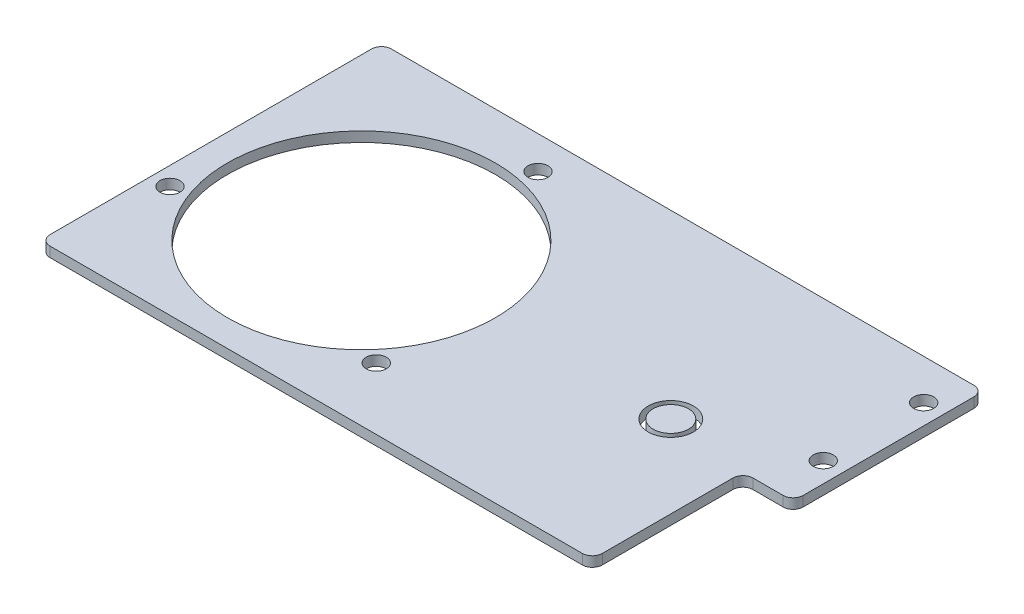
ISO-10303-21;
HEADER;
FILE_DESCRIPTION(('STEP AP214'),'2;1');
FILE_NAME('part.step','',(''),(''),'','','');
FILE_SCHEMA(('AUTOMOTIVE_DESIGN { 1 0 10303 214 1 1 1 1 }'));
ENDSEC;
DATA;
#1=APPLICATION_CONTEXT('core data for automotive mechanical design processes');
#2=APPLICATION_PROTOCOL_DEFINITION('international standard','automotive_design',2000,#1);
#3=PRODUCT_CONTEXT('',#1,'mechanical');
#4=PRODUCT('Part','Part','',(#3));
#5=PRODUCT_RELATED_PRODUCT_CATEGORY('part','',(#4));
#6=PRODUCT_DEFINITION_FORMATION('','',#4);
#7=PRODUCT_DEFINITION_CONTEXT('part definition',#1,'design');
#8=PRODUCT_DEFINITION('design','',#6,#7);
#9=PRODUCT_DEFINITION_SHAPE('','',#8);
#10=(LENGTH_UNIT() NAMED_UNIT(*) SI_UNIT(.MILLI.,.METRE.));
#11=(NAMED_UNIT(*) PLANE_ANGLE_UNIT() SI_UNIT($,.RADIAN.));
#12=(NAMED_UNIT(*) SI_UNIT($,.STERADIAN.) SOLID_ANGLE_UNIT());
#13=UNCERTAINTY_MEASURE_WITH_UNIT(LENGTH_MEASURE(1.E-05),#10,'distance_accuracy_value','');
#14=(GEOMETRIC_REPRESENTATION_CONTEXT(3) GLOBAL_UNCERTAINTY_ASSIGNED_CONTEXT((#13)) GLOBAL_UNIT_ASSIGNED_CONTEXT((#10,
#11,#12)) REPRESENTATION_CONTEXT('',''));
#15=CARTESIAN_POINT('',(0.,0.,0.));
#16=DIRECTION('',(0.,0.,1.));
#17=DIRECTION('',(1.,0.,0.));
#18=AXIS2_PLACEMENT_3D('',#15,#16,#17);
#19=CARTESIAN_POINT('',(254.,6.35,12.7));
#20=DIRECTION('',(0.,-1.,0.));
#21=DIRECTION('',(0.,0.,-1.));
#22=AXIS2_PLACEMENT_3D('',#19,#20,#21);
#23=PLANE('',#22);
#24=CARTESIAN_POINT('',(195.686680000024,6.35,2.27595720048157E-12));
#25=DIRECTION('',(0.,1.,0.));
#26=DIRECTION('',(0.,0.,1.));
#27=AXIS2_PLACEMENT_3D('',#24,#25,#26);
#28=CIRCLE('',#27,14.2875);
#29=CARTESIAN_POINT('',(195.686680000024,6.35,14.2875000000023));
#30=VERTEX_POINT('',#29);
#31=EDGE_CURVE('E12',#30,#30,#28,.T.);
#32=ORIENTED_EDGE('',*,*,#31,.F.);
#33=EDGE_LOOP('',(#32));
#34=FACE_BOUND('',#33,.T.);
#35=CARTESIAN_POINT('',(18.1745568096169,6.35,-93.4999892233898));
#36=DIRECTION('',(0.,1.,0.));
#37=DIRECTION('',(0.,0.,1.));
#38=AXIS2_PLACEMENT_3D('',#35,#36,#37);
#39=CIRCLE('',#38,6.34999999999998);
#40=CARTESIAN_POINT('',(18.1745568096169,6.35,-87.1499892233898));
#41=VERTEX_POINT('',#40);
#42=EDGE_CURVE('E188',#41,#41,#39,.T.);
#43=ORIENTED_EDGE('',*,*,#42,.F.);
#44=EDGE_LOOP('',(#43));
#45=FACE_BOUND('',#44,.T.);
#46=CARTESIAN_POINT('',(266.7,6.35,-88.9000000000001));
#47=DIRECTION('',(0.,1.,0.));
#48=DIRECTION('',(0.,0.,1.));
#49=AXIS2_PLACEMENT_3D('',#46,#47,#48);
#50=CIRCLE('',#49,6.35);
#51=CARTESIAN_POINT('',(266.7,6.35,-82.5500000000001));
#52=VERTEX_POINT('',#51);
#53=EDGE_CURVE('E176',#52,#52,#50,.T.);
#54=ORIENTED_EDGE('',*,*,#53,.F.);
#55=EDGE_LOOP('',(#54));
#56=FACE_BOUND('',#55,.T.);
#57=CARTESIAN_POINT('',(0.,6.35,0.));
#58=DIRECTION('',(0.,1.,0.));
#59=DIRECTION('',(0.,0.,1.));
#60=AXIS2_PLACEMENT_3D('',#57,#58,#59);
#61=CIRCLE('',#60,84.7725);
#62=CARTESIAN_POINT('',(0.,6.35,84.7725));
#63=VERTEX_POINT('',#62);
#64=EDGE_CURVE('E166',#63,#63,#61,.T.);
#65=ORIENTED_EDGE('',*,*,#64,.F.);
#66=EDGE_LOOP('',(#65));
#67=FACE_BOUND('',#66,.T.);
#68=CARTESIAN_POINT('',(254.,6.35,12.7));
#69=DIRECTION('',(0.,-1.,0.));
#70=DIRECTION('',(0.,0.,-1.));
#71=AXIS2_PLACEMENT_3D('',#68,#69,#70);
#72=CIRCLE('',#71,6.35);
#73=CARTESIAN_POINT('',(247.65,6.35,12.7));
#74=VERTEX_POINT('',#73);
#75=CARTESIAN_POINT('',(254.,6.35,6.34999999999998));
#76=VERTEX_POINT('',#75);
#77=EDGE_CURVE('E136',#74,#76,#72,.T.);
#78=ORIENTED_EDGE('',*,*,#77,.T.);
#79=DIRECTION('',(1.,0.,0.));
#80=VECTOR('',#79,1.);
#81=CARTESIAN_POINT('',(254.,6.35,6.34999999999998));
#82=LINE('',#81,#80);
#83=CARTESIAN_POINT('',(273.05,6.35,6.34999999999999));
#84=VERTEX_POINT('',#83);
#85=EDGE_CURVE('E129',#76,#84,#82,.T.);
#86=ORIENTED_EDGE('',*,*,#85,.T.);
#87=CARTESIAN_POINT('',(273.05,6.35,0.));
#88=DIRECTION('',(0.,1.,0.));
#89=DIRECTION('',(0.,0.,1.));
#90=AXIS2_PLACEMENT_3D('',#87,#88,#89);
#91=CIRCLE('',#90,6.35000000000001);
#92=CARTESIAN_POINT('',(279.4,6.35,0.));
#93=VERTEX_POINT('',#92);
#94=EDGE_CURVE('E133',#84,#93,#91,.T.);
#95=ORIENTED_EDGE('',*,*,#94,.T.);
#96=DIRECTION('',(0.,0.,-1.));
#97=VECTOR('',#96,1.);
#98=CARTESIAN_POINT('',(279.4,6.35,-107.95));
#99=LINE('',#98,#97);
#100=CARTESIAN_POINT('',(279.4,6.35,-107.95));
#101=VERTEX_POINT('',#100);
#102=EDGE_CURVE('E154',#93,#101,#99,.T.);
#103=ORIENTED_EDGE('',*,*,#102,.T.);
#104=CARTESIAN_POINT('',(273.05,6.35,-107.95));
#105=DIRECTION('',(0.,1.,0.));
#106=DIRECTION('',(0.,0.,-1.));
#107=AXIS2_PLACEMENT_3D('',#104,#105,#106);
#108=CIRCLE('',#107,6.35000000000002);
#109=CARTESIAN_POINT('',(273.05,6.35,-114.3));
#110=VERTEX_POINT('',#109);
#111=EDGE_CURVE('E156',#101,#110,#108,.T.);
#112=ORIENTED_EDGE('',*,*,#111,.T.);
#113=DIRECTION('',(-1.,0.,0.));
#114=VECTOR('',#113,1.);
#115=CARTESIAN_POINT('',(273.05,6.35,-114.3));
#116=LINE('',#115,#114);
#117=CARTESIAN_POINT('',(-95.25,6.35,-114.3));
#118=VERTEX_POINT('',#117);
#119=EDGE_CURVE('E263',#110,#118,#116,.T.);
#120=ORIENTED_EDGE('',*,*,#119,.T.);
#121=CARTESIAN_POINT('',(-95.25,6.35,-107.95));
#122=DIRECTION('',(0.,1.,0.));
#123=DIRECTION('',(0.,0.,1.));
#124=AXIS2_PLACEMENT_3D('',#121,#122,#123);
#125=CIRCLE('',#124,6.35);
#126=CARTESIAN_POINT('',(-101.6,6.35,-107.95));
#127=VERTEX_POINT('',#126);
#128=EDGE_CURVE('E261',#118,#127,#125,.T.);
#129=ORIENTED_EDGE('',*,*,#128,.T.);
#130=DIRECTION('',(0.,0.,1.));
#131=VECTOR('',#130,1.);
#132=CARTESIAN_POINT('',(-101.6,6.35,-107.95));
#133=LINE('',#132,#131);
#134=CARTESIAN_POINT('',(-101.6,6.35,95.25));
#135=VERTEX_POINT('',#134);
#136=EDGE_CURVE('E259',#127,#135,#133,.T.);
#137=ORIENTED_EDGE('',*,*,#136,.T.);
#138=CARTESIAN_POINT('',(-95.2499999999999,6.35,95.2500000000001));
#139=DIRECTION('',(0.,1.,0.));
#140=DIRECTION('',(0.,0.,-1.));
#141=AXIS2_PLACEMENT_3D('',#138,#139,#140);
#142=CIRCLE('',#141,6.34999999999999);
#143=CARTESIAN_POINT('',(-95.2499999999999,6.35,101.6));
#144=VERTEX_POINT('',#143);
#145=EDGE_CURVE('E257',#135,#144,#142,.T.);
#146=ORIENTED_EDGE('',*,*,#145,.T.);
#147=DIRECTION('',(1.,0.,0.));
#148=VECTOR('',#147,1.);
#149=CARTESIAN_POINT('',(241.3,6.35,101.6));
#150=LINE('',#149,#148);
#151=CARTESIAN_POINT('',(241.3,6.35,101.6));
#152=VERTEX_POINT('',#151);
#153=EDGE_CURVE('E255',#144,#152,#150,.T.);
#154=ORIENTED_EDGE('',*,*,#153,.T.);
#155=CARTESIAN_POINT('',(241.3,6.35,95.25));
#156=DIRECTION('',(0.,1.,0.));
#157=DIRECTION('',(0.,0.,1.));
#158=AXIS2_PLACEMENT_3D('',#155,#156,#157);
#159=CIRCLE('',#158,6.34999999999999);
#160=CARTESIAN_POINT('',(247.65,6.35,95.25));
#161=VERTEX_POINT('',#160);
#162=EDGE_CURVE('E253',#152,#161,#159,.T.);
#163=ORIENTED_EDGE('',*,*,#162,.T.);
#164=DIRECTION('',(0.,0.,-1.));
#165=VECTOR('',#164,1.);
#166=CARTESIAN_POINT('',(247.65,6.35,95.25));
#167=LINE('',#166,#165);
#168=EDGE_CURVE('E191',#161,#74,#167,.T.);
#169=ORIENTED_EDGE('',*,*,#168,.T.);
#170=EDGE_LOOP('',(#78,#86,#95,#103,#112,#120,#129,#137,#146,#154,#163,#169));
#171=FACE_BOUND('',#170,.T.);
#172=CARTESIAN_POINT('',(-90.0606443258351,6.35,31.0103667120436));
#173=DIRECTION('',(0.,1.,0.));
#174=DIRECTION('',(0.,0.,1.));
#175=AXIS2_PLACEMENT_3D('',#172,#173,#174);
#176=CIRCLE('',#175,6.35);
#177=CARTESIAN_POINT('',(-90.0606443258351,6.35,37.3603667120436));
#178=VERTEX_POINT('',#177);
#179=EDGE_CURVE('E169',#178,#178,#176,.T.);
#180=ORIENTED_EDGE('',*,*,#179,.F.);
#181=EDGE_LOOP('',(#180));
#182=FACE_BOUND('',#181,.T.);
#183=CARTESIAN_POINT('',(266.7,6.35,-25.4000000000001));
#184=DIRECTION('',(0.,1.,0.));
#185=DIRECTION('',(0.,0.,1.));
#186=AXIS2_PLACEMENT_3D('',#183,#184,#185);
#187=CIRCLE('',#186,6.35);
#188=CARTESIAN_POINT('',(266.7,6.35,-19.0500000000001));
#189=VERTEX_POINT('',#188);
#190=EDGE_CURVE('E182',#189,#189,#187,.T.);
#191=ORIENTED_EDGE('',*,*,#190,.F.);
#192=EDGE_LOOP('',(#191));
#193=FACE_BOUND('',#192,.T.);
#194=CARTESIAN_POINT('',(71.8860875162181,6.35,62.4896225113469));
#195=DIRECTION('',(0.,1.,0.));
#196=DIRECTION('',(0.,0.,1.));
#197=AXIS2_PLACEMENT_3D('',#194,#195,#196);
#198=CIRCLE('',#197,6.35);
#199=CARTESIAN_POINT('',(71.8860875162181,6.35,68.8396225113469));
#200=VERTEX_POINT('',#199);
#201=EDGE_CURVE('E194',#200,#200,#198,.T.);
#202=ORIENTED_EDGE('',*,*,#201,.F.);
#203=EDGE_LOOP('',(#202));
#204=FACE_BOUND('',#203,.T.);
#205=ADVANCED_FACE('F44',(#34,#45,#56,#67,#171,#182,#193,#204),#23,.F.);
#206=CARTESIAN_POINT('',(254.,0.,12.7));
#207=DIRECTION('',(0.,-1.,0.));
#208=DIRECTION('',(0.,0.,-1.));
#209=AXIS2_PLACEMENT_3D('',#206,#207,#208);
#210=PLANE('',#209);
#211=CARTESIAN_POINT('',(195.686680000024,0.,2.27595720048157E-12));
#212=DIRECTION('',(0.,-1.,0.));
#213=DIRECTION('',(0.,0.,-1.));
#214=AXIS2_PLACEMENT_3D('',#211,#212,#213);
#215=CIRCLE('',#214,14.2875);
#216=CARTESIAN_POINT('',(195.686680000024,0.,-14.2874999999977));
#217=VERTEX_POINT('',#216);
#218=EDGE_CURVE('E52',#217,#217,#215,.T.);
#219=ORIENTED_EDGE('',*,*,#218,.F.);
#220=EDGE_LOOP('',(#219));
#221=FACE_BOUND('',#220,.T.);
#222=CARTESIAN_POINT('',(18.1745568096169,0.,-93.4999892233898));
#223=DIRECTION('',(0.,1.,0.));
#224=DIRECTION('',(0.,0.,1.));
#225=AXIS2_PLACEMENT_3D('',#222,#223,#224);
#226=CIRCLE('',#225,6.34999999999998);
#227=CARTESIAN_POINT('',(18.1745568096169,0.,-87.1499892233898));
#228=VERTEX_POINT('',#227);
#229=EDGE_CURVE('E179',#228,#228,#226,.T.);
#230=ORIENTED_EDGE('',*,*,#229,.T.);
#231=EDGE_LOOP('',(#230));
#232=FACE_BOUND('',#231,.T.);
#233=CARTESIAN_POINT('',(266.7,0.,-88.9000000000001));
#234=DIRECTION('',(0.,1.,0.));
#235=DIRECTION('',(0.,0.,1.));
#236=AXIS2_PLACEMENT_3D('',#233,#234,#235);
#237=CIRCLE('',#236,6.35);
#238=CARTESIAN_POINT('',(266.7,0.,-82.5500000000001));
#239=VERTEX_POINT('',#238);
#240=EDGE_CURVE('E165',#239,#239,#237,.T.);
#241=ORIENTED_EDGE('',*,*,#240,.T.);
#242=EDGE_LOOP('',(#241));
#243=FACE_BOUND('',#242,.T.);
#244=CARTESIAN_POINT('',(0.,0.,0.));
#245=DIRECTION('',(0.,1.,0.));
#246=DIRECTION('',(0.,0.,1.));
#247=AXIS2_PLACEMENT_3D('',#244,#245,#246);
#248=CIRCLE('',#247,84.7725);
#249=CARTESIAN_POINT('',(0.,0.,84.7725));
#250=VERTEX_POINT('',#249);
#251=EDGE_CURVE('E161',#250,#250,#248,.T.);
#252=ORIENTED_EDGE('',*,*,#251,.T.);
#253=EDGE_LOOP('',(#252));
#254=FACE_BOUND('',#253,.T.);
#255=CARTESIAN_POINT('',(254.,0.,12.7));
#256=DIRECTION('',(0.,-1.,0.));
#257=DIRECTION('',(0.,0.,-1.));
#258=AXIS2_PLACEMENT_3D('',#255,#256,#257);
#259=CIRCLE('',#258,6.35);
#260=CARTESIAN_POINT('',(247.65,0.,12.7));
#261=VERTEX_POINT('',#260);
#262=CARTESIAN_POINT('',(254.,0.,6.34999999999998));
#263=VERTEX_POINT('',#262);
#264=EDGE_CURVE('E196',#261,#263,#259,.T.);
#265=ORIENTED_EDGE('',*,*,#264,.F.);
#266=DIRECTION('',(0.,0.,-1.));
#267=VECTOR('',#266,1.);
#268=CARTESIAN_POINT('',(247.65,0.,95.25));
#269=LINE('',#268,#267);
#270=CARTESIAN_POINT('',(247.65,0.,95.25));
#271=VERTEX_POINT('',#270);
#272=EDGE_CURVE('E60',#271,#261,#269,.T.);
#273=ORIENTED_EDGE('',*,*,#272,.F.);
#274=CARTESIAN_POINT('',(241.3,0.,95.25));
#275=DIRECTION('',(0.,1.,0.));
#276=DIRECTION('',(0.,0.,1.));
#277=AXIS2_PLACEMENT_3D('',#274,#275,#276);
#278=CIRCLE('',#277,6.34999999999999);
#279=CARTESIAN_POINT('',(241.3,0.,101.6));
#280=VERTEX_POINT('',#279);
#281=EDGE_CURVE('E232',#280,#271,#278,.T.);
#282=ORIENTED_EDGE('',*,*,#281,.F.);
#283=DIRECTION('',(1.,0.,0.));
#284=VECTOR('',#283,1.);
#285=CARTESIAN_POINT('',(241.3,0.,101.6));
#286=LINE('',#285,#284);
#287=CARTESIAN_POINT('',(-95.2499999999999,0.,101.6));
#288=VERTEX_POINT('',#287);
#289=EDGE_CURVE('E228',#288,#280,#286,.T.);
#290=ORIENTED_EDGE('',*,*,#289,.F.);
#291=CARTESIAN_POINT('',(-95.2499999999999,0.,95.2500000000001));
#292=DIRECTION('',(0.,1.,0.));
#293=DIRECTION('',(0.,0.,-1.));
#294=AXIS2_PLACEMENT_3D('',#291,#292,#293);
#295=CIRCLE('',#294,6.34999999999999);
#296=CARTESIAN_POINT('',(-101.6,0.,95.25));
#297=VERTEX_POINT('',#296);
#298=EDGE_CURVE('E224',#297,#288,#295,.T.);
#299=ORIENTED_EDGE('',*,*,#298,.F.);
#300=DIRECTION('',(0.,0.,1.));
#301=VECTOR('',#300,1.);
#302=CARTESIAN_POINT('',(-101.6,0.,-107.95));
#303=LINE('',#302,#301);
#304=CARTESIAN_POINT('',(-101.6,0.,-107.95));
#305=VERTEX_POINT('',#304);
#306=EDGE_CURVE('E220',#305,#297,#303,.T.);
#307=ORIENTED_EDGE('',*,*,#306,.F.);
#308=CARTESIAN_POINT('',(-95.25,0.,-107.95));
#309=DIRECTION('',(0.,1.,0.));
#310=DIRECTION('',(0.,0.,1.));
#311=AXIS2_PLACEMENT_3D('',#308,#309,#310);
#312=CIRCLE('',#311,6.35);
#313=CARTESIAN_POINT('',(-95.25,0.,-114.3));
#314=VERTEX_POINT('',#313);
#315=EDGE_CURVE('E216',#314,#305,#312,.T.);
#316=ORIENTED_EDGE('',*,*,#315,.F.);
#317=DIRECTION('',(-1.,0.,0.));
#318=VECTOR('',#317,1.);
#319=CARTESIAN_POINT('',(273.05,0.,-114.3));
#320=LINE('',#319,#318);
#321=CARTESIAN_POINT('',(273.05,0.,-114.3));
#322=VERTEX_POINT('',#321);
#323=EDGE_CURVE('E212',#322,#314,#320,.T.);
#324=ORIENTED_EDGE('',*,*,#323,.F.);
#325=CARTESIAN_POINT('',(273.05,0.,-107.95));
#326=DIRECTION('',(0.,1.,0.));
#327=DIRECTION('',(0.,0.,-1.));
#328=AXIS2_PLACEMENT_3D('',#325,#326,#327);
#329=CIRCLE('',#328,6.35000000000002);
#330=CARTESIAN_POINT('',(279.4,0.,-107.95));
#331=VERTEX_POINT('',#330);
#332=EDGE_CURVE('E208',#331,#322,#329,.T.);
#333=ORIENTED_EDGE('',*,*,#332,.F.);
#334=DIRECTION('',(0.,0.,-1.));
#335=VECTOR('',#334,1.);
#336=CARTESIAN_POINT('',(279.4,0.,-107.95));
#337=LINE('',#336,#335);
#338=CARTESIAN_POINT('',(279.4,0.,0.));
#339=VERTEX_POINT('',#338);
#340=EDGE_CURVE('E147',#339,#331,#337,.T.);
#341=ORIENTED_EDGE('',*,*,#340,.F.);
#342=CARTESIAN_POINT('',(273.05,0.,0.));
#343=DIRECTION('',(0.,1.,0.));
#344=DIRECTION('',(0.,0.,1.));
#345=AXIS2_PLACEMENT_3D('',#342,#343,#344);
#346=CIRCLE('',#345,6.35000000000001);
#347=CARTESIAN_POINT('',(273.05,0.,6.34999999999999));
#348=VERTEX_POINT('',#347);
#349=EDGE_CURVE('E148',#348,#339,#346,.T.);
#350=ORIENTED_EDGE('',*,*,#349,.F.);
#351=DIRECTION('',(1.,0.,0.));
#352=VECTOR('',#351,1.);
#353=CARTESIAN_POINT('',(254.,0.,6.34999999999998));
#354=LINE('',#353,#352);
#355=EDGE_CURVE('E144',#263,#348,#354,.T.);
#356=ORIENTED_EDGE('',*,*,#355,.F.);
#357=EDGE_LOOP('',(#265,#273,#282,#290,#299,#307,#316,#324,#333,#341,#350,#356));
#358=FACE_BOUND('',#357,.T.);
#359=CARTESIAN_POINT('',(-90.0606443258351,0.,31.0103667120436));
#360=DIRECTION('',(0.,1.,0.));
#361=DIRECTION('',(0.,0.,1.));
#362=AXIS2_PLACEMENT_3D('',#359,#360,#361);
#363=CIRCLE('',#362,6.35);
#364=CARTESIAN_POINT('',(-90.0606443258351,0.,37.3603667120436));
#365=VERTEX_POINT('',#364);
#366=EDGE_CURVE('E164',#365,#365,#363,.T.);
#367=ORIENTED_EDGE('',*,*,#366,.T.);
#368=EDGE_LOOP('',(#367));
#369=FACE_BOUND('',#368,.T.);
#370=CARTESIAN_POINT('',(266.7,0.,-25.4000000000001));
#371=DIRECTION('',(0.,1.,0.));
#372=DIRECTION('',(0.,0.,1.));
#373=AXIS2_PLACEMENT_3D('',#370,#371,#372);
#374=CIRCLE('',#373,6.35);
#375=CARTESIAN_POINT('',(266.7,0.,-19.0500000000001));
#376=VERTEX_POINT('',#375);
#377=EDGE_CURVE('E173',#376,#376,#374,.T.);
#378=ORIENTED_EDGE('',*,*,#377,.T.);
#379=EDGE_LOOP('',(#378));
#380=FACE_BOUND('',#379,.T.);
#381=CARTESIAN_POINT('',(71.8860875162181,0.,62.4896225113469));
#382=DIRECTION('',(0.,1.,0.));
#383=DIRECTION('',(0.,0.,1.));
#384=AXIS2_PLACEMENT_3D('',#381,#382,#383);
#385=CIRCLE('',#384,6.35);
#386=CARTESIAN_POINT('',(71.8860875162181,0.,68.8396225113469));
#387=VERTEX_POINT('',#386);
#388=EDGE_CURVE('E185',#387,#387,#385,.T.);
#389=ORIENTED_EDGE('',*,*,#388,.T.);
#390=EDGE_LOOP('',(#389));
#391=FACE_BOUND('',#390,.T.);
#392=ADVANCED_FACE('F306',(#221,#232,#243,#254,#358,#369,#380,#391),#210,.T.);
#393=CARTESIAN_POINT('',(254.,6.35,12.7));
#394=DIRECTION('',(0.,-1.,0.));
#395=DIRECTION('',(0.,0.,-1.));
#396=AXIS2_PLACEMENT_3D('',#393,#394,#395);
#397=CYLINDRICAL_SURFACE('',#396,6.35);
#398=ORIENTED_EDGE('',*,*,#264,.T.);
#399=DIRECTION('',(0.,-1.,0.));
#400=VECTOR('',#399,1.);
#401=CARTESIAN_POINT('',(254.,6.35,6.34999999999998));
#402=LINE('',#401,#400);
#403=EDGE_CURVE('E205',#76,#263,#402,.T.);
#404=ORIENTED_EDGE('',*,*,#403,.F.);
#405=ORIENTED_EDGE('',*,*,#77,.F.);
#406=DIRECTION('',(0.,-1.,0.));
#407=VECTOR('',#406,1.);
#408=CARTESIAN_POINT('',(247.65,6.35,12.7));
#409=LINE('',#408,#407);
#410=EDGE_CURVE('E237',#74,#261,#409,.T.);
#411=ORIENTED_EDGE('',*,*,#410,.T.);
#412=EDGE_LOOP('',(#398,#404,#405,#411));
#413=FACE_BOUND('',#412,.T.);
#414=ADVANCED_FACE('F304',(#413),#397,.F.);
#415=CARTESIAN_POINT('',(254.,6.35,6.34999999999998));
#416=DIRECTION('',(0.,0.,-1.));
#417=DIRECTION('',(-1.,0.,0.));
#418=AXIS2_PLACEMENT_3D('',#415,#416,#417);
#419=PLANE('',#418);
#420=ORIENTED_EDGE('',*,*,#355,.T.);
#421=DIRECTION('',(0.,-1.,0.));
#422=VECTOR('',#421,1.);
#423=CARTESIAN_POINT('',(273.05,6.35,6.34999999999999));
#424=LINE('',#423,#422);
#425=EDGE_CURVE('E142',#84,#348,#424,.T.);
#426=ORIENTED_EDGE('',*,*,#425,.F.);
#427=ORIENTED_EDGE('',*,*,#85,.F.);
#428=ORIENTED_EDGE('',*,*,#403,.T.);
#429=EDGE_LOOP('',(#420,#426,#427,#428));
#430=FACE_BOUND('',#429,.T.);
#431=ADVANCED_FACE('F143',(#430),#419,.F.);
#432=CARTESIAN_POINT('',(273.05,6.35,0.));
#433=DIRECTION('',(0.,-1.,0.));
#434=DIRECTION('',(0.,0.,-1.));
#435=AXIS2_PLACEMENT_3D('',#432,#433,#434);
#436=CYLINDRICAL_SURFACE('',#435,6.35000000000001);
#437=ORIENTED_EDGE('',*,*,#349,.T.);
#438=DIRECTION('',(0.,-1.,0.));
#439=VECTOR('',#438,1.);
#440=CARTESIAN_POINT('',(279.4,6.35,0.));
#441=LINE('',#440,#439);
#442=EDGE_CURVE('E152',#93,#339,#441,.T.);
#443=ORIENTED_EDGE('',*,*,#442,.F.);
#444=ORIENTED_EDGE('',*,*,#94,.F.);
#445=ORIENTED_EDGE('',*,*,#425,.T.);
#446=EDGE_LOOP('',(#437,#443,#444,#445));
#447=FACE_BOUND('',#446,.T.);
#448=ADVANCED_FACE('F150',(#447),#436,.T.);
#449=CARTESIAN_POINT('',(279.4,6.35,-107.95));
#450=DIRECTION('',(-1.,0.,0.));
#451=DIRECTION('',(0.,0.,1.));
#452=AXIS2_PLACEMENT_3D('',#449,#450,#451);
#453=PLANE('',#452);
#454=ORIENTED_EDGE('',*,*,#340,.T.);
#455=DIRECTION('',(0.,-1.,0.));
#456=VECTOR('',#455,1.);
#457=CARTESIAN_POINT('',(279.4,6.35,-107.95));
#458=LINE('',#457,#456);
#459=EDGE_CURVE('E209',#101,#331,#458,.T.);
#460=ORIENTED_EDGE('',*,*,#459,.F.);
#461=ORIENTED_EDGE('',*,*,#102,.F.);
#462=ORIENTED_EDGE('',*,*,#442,.T.);
#463=EDGE_LOOP('',(#454,#460,#461,#462));
#464=FACE_BOUND('',#463,.T.);
#465=ADVANCED_FACE('F310',(#464),#453,.F.);
#466=CARTESIAN_POINT('',(273.05,6.35,-107.95));
#467=DIRECTION('',(0.,-1.,0.));
#468=DIRECTION('',(0.,0.,-1.));
#469=AXIS2_PLACEMENT_3D('',#466,#467,#468);
#470=CYLINDRICAL_SURFACE('',#469,6.35000000000002);
#471=ORIENTED_EDGE('',*,*,#332,.T.);
#472=DIRECTION('',(0.,-1.,0.));
#473=VECTOR('',#472,1.);
#474=CARTESIAN_POINT('',(273.05,6.35,-114.3));
#475=LINE('',#474,#473);
#476=EDGE_CURVE('E213',#110,#322,#475,.T.);
#477=ORIENTED_EDGE('',*,*,#476,.F.);
#478=ORIENTED_EDGE('',*,*,#111,.F.);
#479=ORIENTED_EDGE('',*,*,#459,.T.);
#480=EDGE_LOOP('',(#471,#477,#478,#479));
#481=FACE_BOUND('',#480,.T.);
#482=ADVANCED_FACE('F270',(#481),#470,.T.);
#483=CARTESIAN_POINT('',(273.05,6.35,-114.3));
#484=DIRECTION('',(0.,0.,1.));
#485=DIRECTION('',(1.,0.,0.));
#486=AXIS2_PLACEMENT_3D('',#483,#484,#485);
#487=PLANE('',#486);
#488=ORIENTED_EDGE('',*,*,#323,.T.);
#489=DIRECTION('',(0.,-1.,0.));
#490=VECTOR('',#489,1.);
#491=CARTESIAN_POINT('',(-95.25,6.35,-114.3));
#492=LINE('',#491,#490);
#493=EDGE_CURVE('E217',#118,#314,#492,.T.);
#494=ORIENTED_EDGE('',*,*,#493,.F.);
#495=ORIENTED_EDGE('',*,*,#119,.F.);
#496=ORIENTED_EDGE('',*,*,#476,.T.);
#497=EDGE_LOOP('',(#488,#494,#495,#496));
#498=FACE_BOUND('',#497,.T.);
#499=ADVANCED_FACE('F274',(#498),#487,.F.);
#500=CARTESIAN_POINT('',(-95.25,6.35,-107.95));
#501=DIRECTION('',(0.,-1.,0.));
#502=DIRECTION('',(0.,0.,-1.));
#503=AXIS2_PLACEMENT_3D('',#500,#501,#502);
#504=CYLINDRICAL_SURFACE('',#503,6.35);
#505=ORIENTED_EDGE('',*,*,#315,.T.);
#506=DIRECTION('',(0.,-1.,0.));
#507=VECTOR('',#506,1.);
#508=CARTESIAN_POINT('',(-101.6,6.35,-107.95));
#509=LINE('',#508,#507);
#510=EDGE_CURVE('E221',#127,#305,#509,.T.);
#511=ORIENTED_EDGE('',*,*,#510,.F.);
#512=ORIENTED_EDGE('',*,*,#128,.F.);
#513=ORIENTED_EDGE('',*,*,#493,.T.);
#514=EDGE_LOOP('',(#505,#511,#512,#513));
#515=FACE_BOUND('',#514,.T.);
#516=ADVANCED_FACE('F279',(#515),#504,.T.);
#517=CARTESIAN_POINT('',(-101.6,6.35,-107.95));
#518=DIRECTION('',(1.,0.,0.));
#519=DIRECTION('',(0.,0.,-1.));
#520=AXIS2_PLACEMENT_3D('',#517,#518,#519);
#521=PLANE('',#520);
#522=ORIENTED_EDGE('',*,*,#306,.T.);
#523=DIRECTION('',(0.,-1.,0.));
#524=VECTOR('',#523,1.);
#525=CARTESIAN_POINT('',(-101.6,6.35,95.25));
#526=LINE('',#525,#524);
#527=EDGE_CURVE('E225',#135,#297,#526,.T.);
#528=ORIENTED_EDGE('',*,*,#527,.F.);
#529=ORIENTED_EDGE('',*,*,#136,.F.);
#530=ORIENTED_EDGE('',*,*,#510,.T.);
#531=EDGE_LOOP('',(#522,#528,#529,#530));
#532=FACE_BOUND('',#531,.T.);
#533=ADVANCED_FACE('F285',(#532),#521,.F.);
#534=CARTESIAN_POINT('',(-95.2499999999999,6.35,95.2500000000001));
#535=DIRECTION('',(0.,-1.,0.));
#536=DIRECTION('',(0.,0.,-1.));
#537=AXIS2_PLACEMENT_3D('',#534,#535,#536);
#538=CYLINDRICAL_SURFACE('',#537,6.34999999999999);
#539=ORIENTED_EDGE('',*,*,#298,.T.);
#540=DIRECTION('',(0.,-1.,0.));
#541=VECTOR('',#540,1.);
#542=CARTESIAN_POINT('',(-95.2499999999999,6.35,101.6));
#543=LINE('',#542,#541);
#544=EDGE_CURVE('E229',#144,#288,#543,.T.);
#545=ORIENTED_EDGE('',*,*,#544,.F.);
#546=ORIENTED_EDGE('',*,*,#145,.F.);
#547=ORIENTED_EDGE('',*,*,#527,.T.);
#548=EDGE_LOOP('',(#539,#545,#546,#547));
#549=FACE_BOUND('',#548,.T.);
#550=ADVANCED_FACE('F289',(#549),#538,.T.);
#551=CARTESIAN_POINT('',(241.3,6.35,101.6));
#552=DIRECTION('',(0.,0.,-1.));
#553=DIRECTION('',(-1.,0.,0.));
#554=AXIS2_PLACEMENT_3D('',#551,#552,#553);
#555=PLANE('',#554);
#556=ORIENTED_EDGE('',*,*,#289,.T.);
#557=DIRECTION('',(0.,-1.,0.));
#558=VECTOR('',#557,1.);
#559=CARTESIAN_POINT('',(241.3,6.35,101.6));
#560=LINE('',#559,#558);
#561=EDGE_CURVE('E233',#152,#280,#560,.T.);
#562=ORIENTED_EDGE('',*,*,#561,.F.);
#563=ORIENTED_EDGE('',*,*,#153,.F.);
#564=ORIENTED_EDGE('',*,*,#544,.T.);
#565=EDGE_LOOP('',(#556,#562,#563,#564));
#566=FACE_BOUND('',#565,.T.);
#567=ADVANCED_FACE('F294',(#566),#555,.F.);
#568=CARTESIAN_POINT('',(241.3,6.35,95.25));
#569=DIRECTION('',(0.,-1.,0.));
#570=DIRECTION('',(0.,0.,-1.));
#571=AXIS2_PLACEMENT_3D('',#568,#569,#570);
#572=CYLINDRICAL_SURFACE('',#571,6.34999999999999);
#573=ORIENTED_EDGE('',*,*,#281,.T.);
#574=DIRECTION('',(0.,-1.,0.));
#575=VECTOR('',#574,1.);
#576=CARTESIAN_POINT('',(247.65,6.35,95.25));
#577=LINE('',#576,#575);
#578=EDGE_CURVE('E170',#161,#271,#577,.T.);
#579=ORIENTED_EDGE('',*,*,#578,.F.);
#580=ORIENTED_EDGE('',*,*,#162,.F.);
#581=ORIENTED_EDGE('',*,*,#561,.T.);
#582=EDGE_LOOP('',(#573,#579,#580,#581));
#583=FACE_BOUND('',#582,.T.);
#584=ADVANCED_FACE('F299',(#583),#572,.T.);
#585=CARTESIAN_POINT('',(247.65,6.35,95.25));
#586=DIRECTION('',(-1.,0.,0.));
#587=DIRECTION('',(0.,0.,1.));
#588=AXIS2_PLACEMENT_3D('',#585,#586,#587);
#589=PLANE('',#588);
#590=ORIENTED_EDGE('',*,*,#272,.T.);
#591=ORIENTED_EDGE('',*,*,#410,.F.);
#592=ORIENTED_EDGE('',*,*,#168,.F.);
#593=ORIENTED_EDGE('',*,*,#578,.T.);
#594=EDGE_LOOP('',(#590,#591,#592,#593));
#595=FACE_BOUND('',#594,.T.);
#596=ADVANCED_FACE('F301',(#595),#589,.F.);
#597=CARTESIAN_POINT('',(0.,6.35,0.));
#598=DIRECTION('',(0.,-1.,0.));
#599=DIRECTION('',(0.,0.,-1.));
#600=AXIS2_PLACEMENT_3D('',#597,#598,#599);
#601=CYLINDRICAL_SURFACE('',#600,84.7725);
#602=ORIENTED_EDGE('',*,*,#64,.T.);
#603=EDGE_LOOP('',(#602));
#604=FACE_BOUND('',#603,.T.);
#605=ORIENTED_EDGE('',*,*,#251,.F.);
#606=EDGE_LOOP('',(#605));
#607=FACE_BOUND('',#606,.T.);
#608=ADVANCED_FACE('F333',(#604,#607),#601,.F.);
#609=CARTESIAN_POINT('',(-90.0606443258351,6.35,31.0103667120436));
#610=DIRECTION('',(0.,-1.,0.));
#611=DIRECTION('',(0.,0.,-1.));
#612=AXIS2_PLACEMENT_3D('',#609,#610,#611);
#613=CYLINDRICAL_SURFACE('',#612,6.35);
#614=ORIENTED_EDGE('',*,*,#179,.T.);
#615=EDGE_LOOP('',(#614));
#616=FACE_BOUND('',#615,.T.);
#617=ORIENTED_EDGE('',*,*,#366,.F.);
#618=EDGE_LOOP('',(#617));
#619=FACE_BOUND('',#618,.T.);
#620=ADVANCED_FACE('F336',(#616,#619),#613,.F.);
#621=CARTESIAN_POINT('',(266.7,6.35,-88.9000000000001));
#622=DIRECTION('',(0.,-1.,0.));
#623=DIRECTION('',(0.,0.,-1.));
#624=AXIS2_PLACEMENT_3D('',#621,#622,#623);
#625=CYLINDRICAL_SURFACE('',#624,6.35);
#626=ORIENTED_EDGE('',*,*,#53,.T.);
#627=EDGE_LOOP('',(#626));
#628=FACE_BOUND('',#627,.T.);
#629=ORIENTED_EDGE('',*,*,#240,.F.);
#630=EDGE_LOOP('',(#629));
#631=FACE_BOUND('',#630,.T.);
#632=ADVANCED_FACE('F344',(#628,#631),#625,.F.);
#633=CARTESIAN_POINT('',(266.7,6.35,-25.4000000000001));
#634=DIRECTION('',(0.,-1.,0.));
#635=DIRECTION('',(0.,0.,-1.));
#636=AXIS2_PLACEMENT_3D('',#633,#634,#635);
#637=CYLINDRICAL_SURFACE('',#636,6.35);
#638=ORIENTED_EDGE('',*,*,#190,.T.);
#639=EDGE_LOOP('',(#638));
#640=FACE_BOUND('',#639,.T.);
#641=ORIENTED_EDGE('',*,*,#377,.F.);
#642=EDGE_LOOP('',(#641));
#643=FACE_BOUND('',#642,.T.);
#644=ADVANCED_FACE('F352',(#640,#643),#637,.F.);
#645=CARTESIAN_POINT('',(18.1745568096169,6.35,-93.4999892233898));
#646=DIRECTION('',(0.,-1.,0.));
#647=DIRECTION('',(0.,0.,-1.));
#648=AXIS2_PLACEMENT_3D('',#645,#646,#647);
#649=CYLINDRICAL_SURFACE('',#648,6.34999999999998);
#650=ORIENTED_EDGE('',*,*,#42,.T.);
#651=EDGE_LOOP('',(#650));
#652=FACE_BOUND('',#651,.T.);
#653=ORIENTED_EDGE('',*,*,#229,.F.);
#654=EDGE_LOOP('',(#653));
#655=FACE_BOUND('',#654,.T.);
#656=ADVANCED_FACE('F356',(#652,#655),#649,.F.);
#657=CARTESIAN_POINT('',(71.8860875162181,6.35,62.4896225113469));
#658=DIRECTION('',(0.,-1.,0.));
#659=DIRECTION('',(0.,0.,-1.));
#660=AXIS2_PLACEMENT_3D('',#657,#658,#659);
#661=CYLINDRICAL_SURFACE('',#660,6.35);
#662=ORIENTED_EDGE('',*,*,#201,.T.);
#663=EDGE_LOOP('',(#662));
#664=FACE_BOUND('',#663,.T.);
#665=ORIENTED_EDGE('',*,*,#388,.F.);
#666=EDGE_LOOP('',(#665));
#667=FACE_BOUND('',#666,.T.);
#668=ADVANCED_FACE('F360',(#664,#667),#661,.F.);
#669=CARTESIAN_POINT('',(195.686680000024,-3.302,2.27595720048157E-12));
#670=DIRECTION('',(0.,1.,0.));
#671=DIRECTION('',(0.,0.,1.));
#672=AXIS2_PLACEMENT_3D('',#669,#670,#671);
#673=CYLINDRICAL_SURFACE('',#672,14.2875);
#674=ORIENTED_EDGE('',*,*,#218,.T.);
#675=EDGE_LOOP('',(#674));
#676=FACE_BOUND('',#675,.T.);
#677=ORIENTED_EDGE('',*,*,#31,.T.);
#678=EDGE_LOOP('',(#677));
#679=FACE_BOUND('',#678,.T.);
#680=ADVANCED_FACE('F364',(#676,#679),#673,.F.);
#681=CLOSED_SHELL('',(#205,#392,#414,#431,#448,#465,#482,#499,#516,#533,#550,#567,#584,#596,
#608,#620,#632,#644,#656,#668,#680));
#682=MANIFOLD_SOLID_BREP('B2',#681);
#683=CARTESIAN_POINT('',(254.,0.,12.7));
#684=DIRECTION('',(0.,-1.,0.));
#685=DIRECTION('',(0.,0.,-1.));
#686=AXIS2_PLACEMENT_3D('',#683,#684,#685);
#687=PLANE('',#686);
#688=CARTESIAN_POINT('',(195.686680000024,0.,2.27595720048157E-12));
#689=DIRECTION('',(0.,-1.,0.));
#690=DIRECTION('',(0.,0.,-1.));
#691=AXIS2_PLACEMENT_3D('',#688,#689,#690);
#692=CIRCLE('',#691,11.176);
#693=CARTESIAN_POINT('',(195.686680000024,0.,-11.1759999999977));
#694=VERTEX_POINT('',#693);
#695=EDGE_CURVE('E43',#694,#694,#692,.T.);
#696=ORIENTED_EDGE('',*,*,#695,.T.);
#697=EDGE_LOOP('',(#696));
#698=FACE_BOUND('',#697,.T.);
#699=ADVANCED_FACE('F537',(#698),#687,.T.);
#700=CARTESIAN_POINT('',(195.686680000024,-3.302,2.27595720048157E-12));
#701=DIRECTION('',(0.,1.,0.));
#702=DIRECTION('',(0.,0.,1.));
#703=AXIS2_PLACEMENT_3D('',#700,#701,#702);
#704=CYLINDRICAL_SURFACE('',#703,11.176);
#705=ORIENTED_EDGE('',*,*,#695,.F.);
#706=EDGE_LOOP('',(#705));
#707=FACE_BOUND('',#706,.T.);
#708=CARTESIAN_POINT('',(195.686680000024,6.35,2.27595720048157E-12));
#709=DIRECTION('',(0.,1.,0.));
#710=DIRECTION('',(0.,0.,1.));
#711=AXIS2_PLACEMENT_3D('',#708,#709,#710);
#712=CIRCLE('',#711,11.176);
#713=CARTESIAN_POINT('',(195.686680000024,6.35,11.1760000000023));
#714=VERTEX_POINT('',#713);
#715=EDGE_CURVE('E543',#714,#714,#712,.T.);
#716=ORIENTED_EDGE('',*,*,#715,.F.);
#717=EDGE_LOOP('',(#716));
#718=FACE_BOUND('',#717,.T.);
#719=ADVANCED_FACE('F551',(#707,#718),#704,.T.);
#720=CARTESIAN_POINT('',(254.,6.35,12.7));
#721=DIRECTION('',(0.,-1.,0.));
#722=DIRECTION('',(0.,0.,-1.));
#723=AXIS2_PLACEMENT_3D('',#720,#721,#722);
#724=PLANE('',#723);
#725=ORIENTED_EDGE('',*,*,#715,.T.);
#726=EDGE_LOOP('',(#725));
#727=FACE_BOUND('',#726,.T.);
#728=ADVANCED_FACE('F549',(#727),#724,.F.);
#729=CLOSED_SHELL('',(#699,#719,#728));
#730=MANIFOLD_SOLID_BREP('B6',#729);
#731=ADVANCED_BREP_SHAPE_REPRESENTATION('',(#18,#682,#730),#14);
#732=SHAPE_DEFINITION_REPRESENTATION(#9,#731);
ENDSEC;
END-ISO-10303-21;
